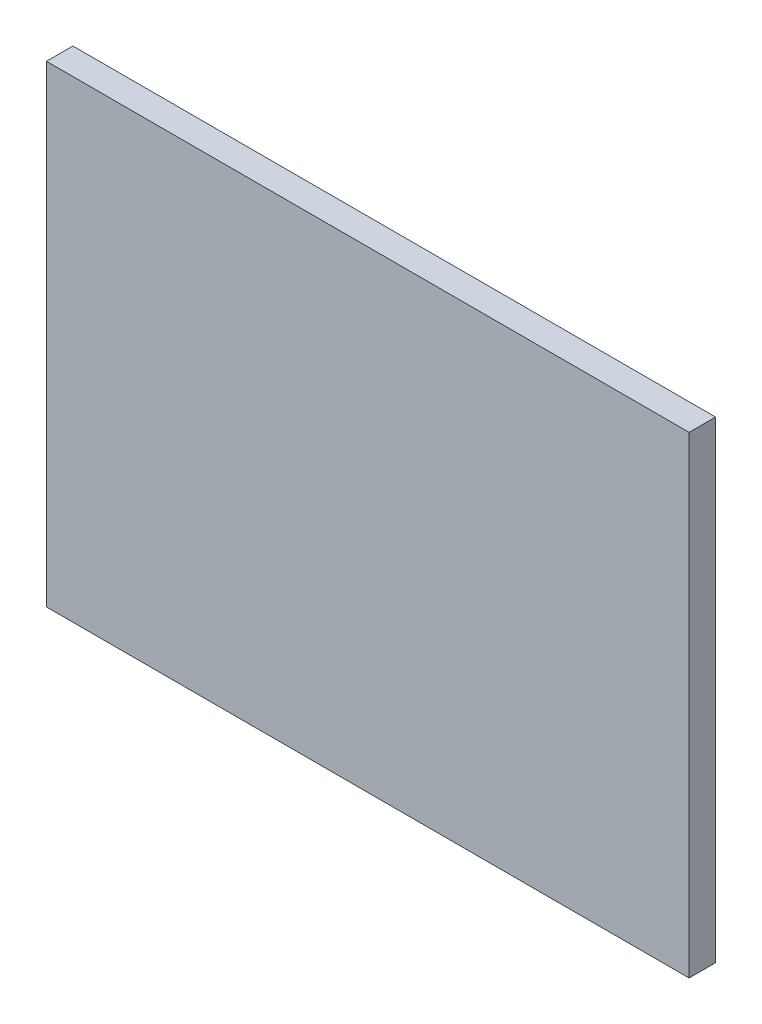
ISO-10303-21;
HEADER;
FILE_DESCRIPTION(('STEP AP214'),'2;1');
FILE_NAME('part.step','',(''),(''),'','','');
FILE_SCHEMA(('AUTOMOTIVE_DESIGN { 1 0 10303 214 1 1 1 1 }'));
ENDSEC;
DATA;
#1=APPLICATION_CONTEXT('core data for automotive mechanical design processes');
#2=APPLICATION_PROTOCOL_DEFINITION('international standard','automotive_design',2000,#1);
#3=PRODUCT_CONTEXT('',#1,'mechanical');
#4=PRODUCT('Part','Part','',(#3));
#5=PRODUCT_RELATED_PRODUCT_CATEGORY('part','',(#4));
#6=PRODUCT_DEFINITION_FORMATION('','',#4);
#7=PRODUCT_DEFINITION_CONTEXT('part definition',#1,'design');
#8=PRODUCT_DEFINITION('design','',#6,#7);
#9=PRODUCT_DEFINITION_SHAPE('','',#8);
#10=(LENGTH_UNIT() NAMED_UNIT(*) SI_UNIT(.MILLI.,.METRE.));
#11=(NAMED_UNIT(*) PLANE_ANGLE_UNIT() SI_UNIT($,.RADIAN.));
#12=(NAMED_UNIT(*) SI_UNIT($,.STERADIAN.) SOLID_ANGLE_UNIT());
#13=UNCERTAINTY_MEASURE_WITH_UNIT(LENGTH_MEASURE(1.E-05),#10,'distance_accuracy_value','');
#14=(GEOMETRIC_REPRESENTATION_CONTEXT(3) GLOBAL_UNCERTAINTY_ASSIGNED_CONTEXT((#13)) GLOBAL_UNIT_ASSIGNED_CONTEXT((#10,
#11,#12)) REPRESENTATION_CONTEXT('',''));
#15=CARTESIAN_POINT('',(0.,0.,0.));
#16=DIRECTION('',(0.,0.,1.));
#17=DIRECTION('',(1.,0.,0.));
#18=AXIS2_PLACEMENT_3D('',#15,#16,#17);
#19=CARTESIAN_POINT('',(-170.,-125.,14.));
#20=DIRECTION('',(0.,0.,1.));
#21=DIRECTION('',(1.,0.,0.));
#22=AXIS2_PLACEMENT_3D('',#19,#20,#21);
#23=PLANE('',#22);
#24=DIRECTION('',(0.,-1.,0.));
#25=VECTOR('',#24,1.);
#26=CARTESIAN_POINT('',(-170.,125.,14.));
#27=LINE('',#26,#25);
#28=CARTESIAN_POINT('',(-170.,125.,14.));
#29=VERTEX_POINT('',#28);
#30=CARTESIAN_POINT('',(-170.,-125.,14.));
#31=VERTEX_POINT('',#30);
#32=EDGE_CURVE('E83',#29,#31,#27,.T.);
#33=ORIENTED_EDGE('',*,*,#32,.T.);
#34=DIRECTION('',(1.,0.,0.));
#35=VECTOR('',#34,1.);
#36=CARTESIAN_POINT('',(-170.,-125.,14.));
#37=LINE('',#36,#35);
#38=CARTESIAN_POINT('',(170.,-125.,14.));
#39=VERTEX_POINT('',#38);
#40=EDGE_CURVE('E79',#31,#39,#37,.T.);
#41=ORIENTED_EDGE('',*,*,#40,.T.);
#42=DIRECTION('',(0.,1.,0.));
#43=VECTOR('',#42,1.);
#44=CARTESIAN_POINT('',(170.,125.,14.));
#45=LINE('',#44,#43);
#46=CARTESIAN_POINT('',(170.,125.,14.));
#47=VERTEX_POINT('',#46);
#48=EDGE_CURVE('E81',#39,#47,#45,.T.);
#49=ORIENTED_EDGE('',*,*,#48,.T.);
#50=DIRECTION('',(-1.,0.,0.));
#51=VECTOR('',#50,1.);
#52=CARTESIAN_POINT('',(-170.,125.,14.));
#53=LINE('',#52,#51);
#54=EDGE_CURVE('E49',#47,#29,#53,.T.);
#55=ORIENTED_EDGE('',*,*,#54,.T.);
#56=EDGE_LOOP('',(#33,#41,#49,#55));
#57=FACE_BOUND('',#56,.T.);
#58=ADVANCED_FACE('F32',(#57),#23,.T.);
#59=CARTESIAN_POINT('',(-170.,-125.,0.));
#60=DIRECTION('',(0.,0.,1.));
#61=DIRECTION('',(1.,0.,0.));
#62=AXIS2_PLACEMENT_3D('',#59,#60,#61);
#63=PLANE('',#62);
#64=DIRECTION('',(0.,-1.,0.));
#65=VECTOR('',#64,1.);
#66=CARTESIAN_POINT('',(-170.,125.,0.));
#67=LINE('',#66,#65);
#68=CARTESIAN_POINT('',(-170.,125.,0.));
#69=VERTEX_POINT('',#68);
#70=CARTESIAN_POINT('',(-170.,-125.,0.));
#71=VERTEX_POINT('',#70);
#72=EDGE_CURVE('E95',#69,#71,#67,.T.);
#73=ORIENTED_EDGE('',*,*,#72,.F.);
#74=DIRECTION('',(-1.,0.,0.));
#75=VECTOR('',#74,1.);
#76=CARTESIAN_POINT('',(-170.,125.,0.));
#77=LINE('',#76,#75);
#78=CARTESIAN_POINT('',(170.,125.,0.));
#79=VERTEX_POINT('',#78);
#80=EDGE_CURVE('E72',#79,#69,#77,.T.);
#81=ORIENTED_EDGE('',*,*,#80,.F.);
#82=DIRECTION('',(0.,1.,0.));
#83=VECTOR('',#82,1.);
#84=CARTESIAN_POINT('',(170.,125.,0.));
#85=LINE('',#84,#83);
#86=CARTESIAN_POINT('',(170.,-125.,0.));
#87=VERTEX_POINT('',#86);
#88=EDGE_CURVE('E66',#87,#79,#85,.T.);
#89=ORIENTED_EDGE('',*,*,#88,.F.);
#90=DIRECTION('',(1.,0.,0.));
#91=VECTOR('',#90,1.);
#92=CARTESIAN_POINT('',(-170.,-125.,0.));
#93=LINE('',#92,#91);
#94=EDGE_CURVE('E87',#71,#87,#93,.T.);
#95=ORIENTED_EDGE('',*,*,#94,.F.);
#96=EDGE_LOOP('',(#73,#81,#89,#95));
#97=FACE_BOUND('',#96,.T.);
#98=ADVANCED_FACE('F105',(#97),#63,.F.);
#99=CARTESIAN_POINT('',(-170.,125.,14.));
#100=DIRECTION('',(1.,0.,0.));
#101=DIRECTION('',(0.,0.,-1.));
#102=AXIS2_PLACEMENT_3D('',#99,#100,#101);
#103=PLANE('',#102);
#104=ORIENTED_EDGE('',*,*,#72,.T.);
#105=DIRECTION('',(0.,0.,-1.));
#106=VECTOR('',#105,1.);
#107=CARTESIAN_POINT('',(-170.,-125.,14.));
#108=LINE('',#107,#106);
#109=EDGE_CURVE('E11',#31,#71,#108,.T.);
#110=ORIENTED_EDGE('',*,*,#109,.F.);
#111=ORIENTED_EDGE('',*,*,#32,.F.);
#112=DIRECTION('',(0.,0.,-1.));
#113=VECTOR('',#112,1.);
#114=CARTESIAN_POINT('',(-170.,125.,14.));
#115=LINE('',#114,#113);
#116=EDGE_CURVE('E91',#29,#69,#115,.T.);
#117=ORIENTED_EDGE('',*,*,#116,.T.);
#118=EDGE_LOOP('',(#104,#110,#111,#117));
#119=FACE_BOUND('',#118,.T.);
#120=ADVANCED_FACE('F34',(#119),#103,.F.);
#121=CARTESIAN_POINT('',(-170.,-125.,14.));
#122=DIRECTION('',(0.,1.,0.));
#123=DIRECTION('',(0.,0.,1.));
#124=AXIS2_PLACEMENT_3D('',#121,#122,#123);
#125=PLANE('',#124);
#126=ORIENTED_EDGE('',*,*,#94,.T.);
#127=DIRECTION('',(0.,0.,-1.));
#128=VECTOR('',#127,1.);
#129=CARTESIAN_POINT('',(170.,-125.,14.));
#130=LINE('',#129,#128);
#131=EDGE_CURVE('E41',#39,#87,#130,.T.);
#132=ORIENTED_EDGE('',*,*,#131,.F.);
#133=ORIENTED_EDGE('',*,*,#40,.F.);
#134=ORIENTED_EDGE('',*,*,#109,.T.);
#135=EDGE_LOOP('',(#126,#132,#133,#134));
#136=FACE_BOUND('',#135,.T.);
#137=ADVANCED_FACE('F86',(#136),#125,.F.);
#138=CARTESIAN_POINT('',(170.,125.,14.));
#139=DIRECTION('',(-1.,0.,0.));
#140=DIRECTION('',(0.,0.,1.));
#141=AXIS2_PLACEMENT_3D('',#138,#139,#140);
#142=PLANE('',#141);
#143=ORIENTED_EDGE('',*,*,#88,.T.);
#144=DIRECTION('',(0.,0.,-1.));
#145=VECTOR('',#144,1.);
#146=CARTESIAN_POINT('',(170.,125.,14.));
#147=LINE('',#146,#145);
#148=EDGE_CURVE('E88',#47,#79,#147,.T.);
#149=ORIENTED_EDGE('',*,*,#148,.F.);
#150=ORIENTED_EDGE('',*,*,#48,.F.);
#151=ORIENTED_EDGE('',*,*,#131,.T.);
#152=EDGE_LOOP('',(#143,#149,#150,#151));
#153=FACE_BOUND('',#152,.T.);
#154=ADVANCED_FACE('F89',(#153),#142,.F.);
#155=CARTESIAN_POINT('',(-170.,125.,14.));
#156=DIRECTION('',(0.,-1.,0.));
#157=DIRECTION('',(0.,0.,-1.));
#158=AXIS2_PLACEMENT_3D('',#155,#156,#157);
#159=PLANE('',#158);
#160=ORIENTED_EDGE('',*,*,#80,.T.);
#161=ORIENTED_EDGE('',*,*,#116,.F.);
#162=ORIENTED_EDGE('',*,*,#54,.F.);
#163=ORIENTED_EDGE('',*,*,#148,.T.);
#164=EDGE_LOOP('',(#160,#161,#162,#163));
#165=FACE_BOUND('',#164,.T.);
#166=ADVANCED_FACE('F102',(#165),#159,.F.);
#167=CLOSED_SHELL('',(#58,#98,#120,#137,#154,#166));
#168=MANIFOLD_SOLID_BREP('B2',#167);
#169=ADVANCED_BREP_SHAPE_REPRESENTATION('',(#18,#168),#14);
#170=SHAPE_DEFINITION_REPRESENTATION(#9,#169);
ENDSEC;
END-ISO-10303-21;
